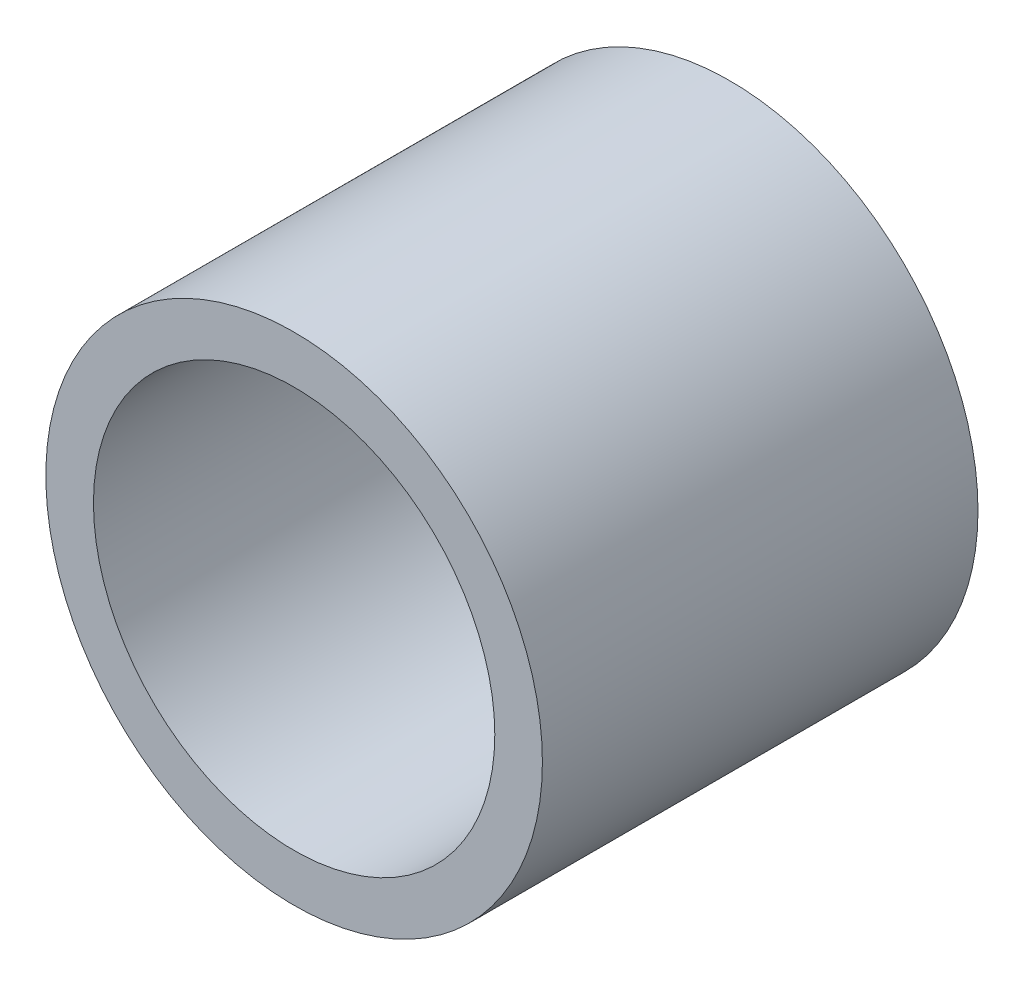
ISO-10303-21;
HEADER;
FILE_DESCRIPTION(('STEP AP214'),'2;1');
FILE_NAME('part.step','',(''),(''),'','','');
FILE_SCHEMA(('AUTOMOTIVE_DESIGN { 1 0 10303 214 1 1 1 1 }'));
ENDSEC;
DATA;
#1=APPLICATION_CONTEXT('core data for automotive mechanical design processes');
#2=APPLICATION_PROTOCOL_DEFINITION('international standard','automotive_design',2000,#1);
#3=PRODUCT_CONTEXT('',#1,'mechanical');
#4=PRODUCT('Part','Part','',(#3));
#5=PRODUCT_RELATED_PRODUCT_CATEGORY('part','',(#4));
#6=PRODUCT_DEFINITION_FORMATION('','',#4);
#7=PRODUCT_DEFINITION_CONTEXT('part definition',#1,'design');
#8=PRODUCT_DEFINITION('design','',#6,#7);
#9=PRODUCT_DEFINITION_SHAPE('','',#8);
#10=(LENGTH_UNIT() NAMED_UNIT(*) SI_UNIT(.MILLI.,.METRE.));
#11=(NAMED_UNIT(*) PLANE_ANGLE_UNIT() SI_UNIT($,.RADIAN.));
#12=(NAMED_UNIT(*) SI_UNIT($,.STERADIAN.) SOLID_ANGLE_UNIT());
#13=UNCERTAINTY_MEASURE_WITH_UNIT(LENGTH_MEASURE(1.E-05),#10,'distance_accuracy_value','');
#14=(GEOMETRIC_REPRESENTATION_CONTEXT(3) GLOBAL_UNCERTAINTY_ASSIGNED_CONTEXT((#13)) GLOBAL_UNIT_ASSIGNED_CONTEXT((#10,
#11,#12)) REPRESENTATION_CONTEXT('',''));
#15=CARTESIAN_POINT('',(0.,0.,0.));
#16=DIRECTION('',(0.,0.,1.));
#17=DIRECTION('',(1.,0.,0.));
#18=AXIS2_PLACEMENT_3D('',#15,#16,#17);
#19=CARTESIAN_POINT('',(0.,0.,7.));
#20=DIRECTION('',(0.,0.,1.));
#21=DIRECTION('',(1.,0.,0.));
#22=AXIS2_PLACEMENT_3D('',#19,#20,#21);
#23=PLANE('',#22);
#24=CARTESIAN_POINT('',(0.,0.,7.));
#25=DIRECTION('',(0.,0.,1.));
#26=DIRECTION('',(1.,0.,0.));
#27=AXIS2_PLACEMENT_3D('',#24,#25,#26);
#28=CIRCLE('',#27,3.99);
#29=CARTESIAN_POINT('',(3.99,0.,7.));
#30=VERTEX_POINT('',#29);
#31=EDGE_CURVE('E10',#30,#30,#28,.T.);
#32=ORIENTED_EDGE('',*,*,#31,.T.);
#33=EDGE_LOOP('',(#32));
#34=FACE_BOUND('',#33,.T.);
#35=CARTESIAN_POINT('',(0.,0.,7.));
#36=DIRECTION('',(0.,0.,1.));
#37=DIRECTION('',(1.,0.,0.));
#38=AXIS2_PLACEMENT_3D('',#35,#36,#37);
#39=CIRCLE('',#38,3.225);
#40=CARTESIAN_POINT('',(3.225,0.,7.));
#41=VERTEX_POINT('',#40);
#42=EDGE_CURVE('E55',#41,#41,#39,.T.);
#43=ORIENTED_EDGE('',*,*,#42,.F.);
#44=EDGE_LOOP('',(#43));
#45=FACE_BOUND('',#44,.T.);
#46=ADVANCED_FACE('F41',(#34,#45),#23,.T.);
#47=CARTESIAN_POINT('',(0.,0.,0.));
#48=DIRECTION('',(0.,0.,1.));
#49=DIRECTION('',(1.,0.,0.));
#50=AXIS2_PLACEMENT_3D('',#47,#48,#49);
#51=PLANE('',#50);
#52=CARTESIAN_POINT('',(0.,0.,0.));
#53=DIRECTION('',(0.,0.,1.));
#54=DIRECTION('',(1.,0.,0.));
#55=AXIS2_PLACEMENT_3D('',#52,#53,#54);
#56=CIRCLE('',#55,3.99);
#57=CARTESIAN_POINT('',(3.99,0.,0.));
#58=VERTEX_POINT('',#57);
#59=EDGE_CURVE('E44',#58,#58,#56,.T.);
#60=ORIENTED_EDGE('',*,*,#59,.F.);
#61=EDGE_LOOP('',(#60));
#62=FACE_BOUND('',#61,.T.);
#63=CARTESIAN_POINT('',(0.,0.,0.));
#64=DIRECTION('',(0.,0.,1.));
#65=DIRECTION('',(1.,0.,0.));
#66=AXIS2_PLACEMENT_3D('',#63,#64,#65);
#67=CIRCLE('',#66,3.225);
#68=CARTESIAN_POINT('',(3.225,0.,0.));
#69=VERTEX_POINT('',#68);
#70=EDGE_CURVE('E53',#69,#69,#67,.T.);
#71=ORIENTED_EDGE('',*,*,#70,.T.);
#72=EDGE_LOOP('',(#71));
#73=FACE_BOUND('',#72,.T.);
#74=ADVANCED_FACE('F63',(#62,#73),#51,.F.);
#75=CARTESIAN_POINT('',(0.,0.,7.));
#76=DIRECTION('',(0.,0.,-1.));
#77=DIRECTION('',(-1.,0.,0.));
#78=AXIS2_PLACEMENT_3D('',#75,#76,#77);
#79=CYLINDRICAL_SURFACE('',#78,3.99);
#80=ORIENTED_EDGE('',*,*,#31,.F.);
#81=EDGE_LOOP('',(#80));
#82=FACE_BOUND('',#81,.T.);
#83=ORIENTED_EDGE('',*,*,#59,.T.);
#84=EDGE_LOOP('',(#83));
#85=FACE_BOUND('',#84,.T.);
#86=ADVANCED_FACE('F43',(#82,#85),#79,.T.);
#87=CARTESIAN_POINT('',(0.,0.,7.));
#88=DIRECTION('',(0.,0.,-1.));
#89=DIRECTION('',(-1.,0.,0.));
#90=AXIS2_PLACEMENT_3D('',#87,#88,#89);
#91=CYLINDRICAL_SURFACE('',#90,3.225);
#92=ORIENTED_EDGE('',*,*,#42,.T.);
#93=EDGE_LOOP('',(#92));
#94=FACE_BOUND('',#93,.T.);
#95=ORIENTED_EDGE('',*,*,#70,.F.);
#96=EDGE_LOOP('',(#95));
#97=FACE_BOUND('',#96,.T.);
#98=ADVANCED_FACE('F58',(#94,#97),#91,.F.);
#99=CLOSED_SHELL('',(#46,#74,#86,#98));
#100=MANIFOLD_SOLID_BREP('B2',#99);
#101=ADVANCED_BREP_SHAPE_REPRESENTATION('',(#18,#100),#14);
#102=SHAPE_DEFINITION_REPRESENTATION(#9,#101);
ENDSEC;
END-ISO-10303-21;
